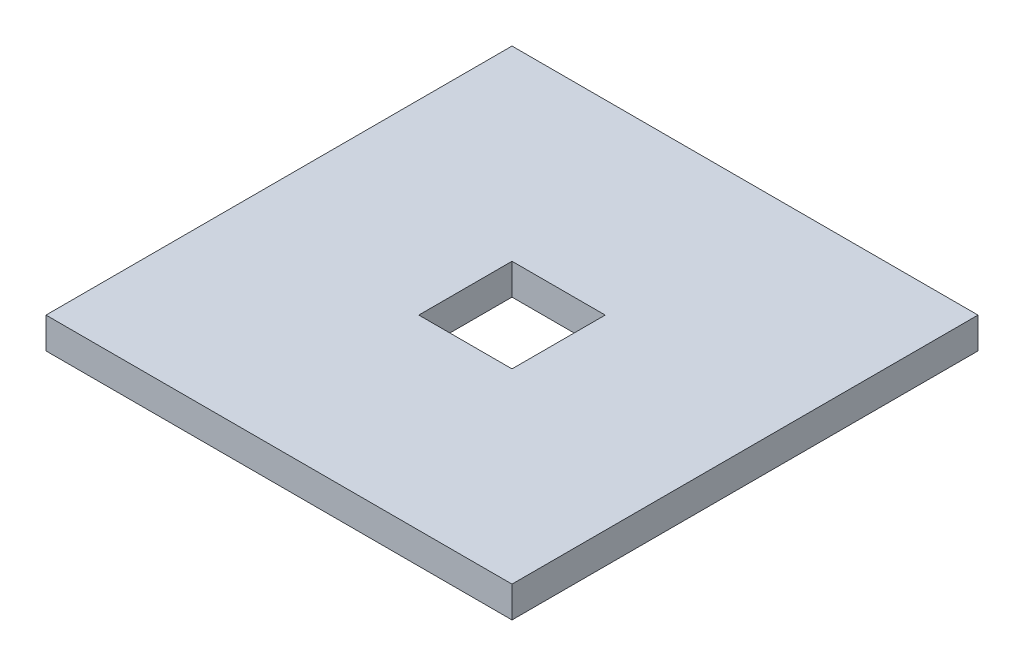
ISO-10303-21;
HEADER;
FILE_DESCRIPTION(('STEP AP214'),'2;1');
FILE_NAME('part.step','',(''),(''),'','','');
FILE_SCHEMA(('AUTOMOTIVE_DESIGN { 1 0 10303 214 1 1 1 1 }'));
ENDSEC;
DATA;
#1=APPLICATION_CONTEXT('core data for automotive mechanical design processes');
#2=APPLICATION_PROTOCOL_DEFINITION('international standard','automotive_design',2000,#1);
#3=PRODUCT_CONTEXT('',#1,'mechanical');
#4=PRODUCT('Part','Part','',(#3));
#5=PRODUCT_RELATED_PRODUCT_CATEGORY('part','',(#4));
#6=PRODUCT_DEFINITION_FORMATION('','',#4);
#7=PRODUCT_DEFINITION_CONTEXT('part definition',#1,'design');
#8=PRODUCT_DEFINITION('design','',#6,#7);
#9=PRODUCT_DEFINITION_SHAPE('','',#8);
#10=(LENGTH_UNIT() NAMED_UNIT(*) SI_UNIT(.MILLI.,.METRE.));
#11=(NAMED_UNIT(*) PLANE_ANGLE_UNIT() SI_UNIT($,.RADIAN.));
#12=(NAMED_UNIT(*) SI_UNIT($,.STERADIAN.) SOLID_ANGLE_UNIT());
#13=UNCERTAINTY_MEASURE_WITH_UNIT(LENGTH_MEASURE(1.E-05),#10,'distance_accuracy_value','');
#14=(GEOMETRIC_REPRESENTATION_CONTEXT(3) GLOBAL_UNCERTAINTY_ASSIGNED_CONTEXT((#13)) GLOBAL_UNIT_ASSIGNED_CONTEXT((#10,
#11,#12)) REPRESENTATION_CONTEXT('',''));
#15=CARTESIAN_POINT('',(0.,0.,0.));
#16=DIRECTION('',(0.,0.,1.));
#17=DIRECTION('',(1.,0.,0.));
#18=AXIS2_PLACEMENT_3D('',#15,#16,#17);
#19=CARTESIAN_POINT('',(0.,100.,-900.));
#20=DIRECTION('',(0.,0.,-1.));
#21=DIRECTION('',(-1.,0.,0.));
#22=AXIS2_PLACEMENT_3D('',#19,#20,#21);
#23=PLANE('',#22);
#24=DIRECTION('',(1.,0.,0.));
#25=VECTOR('',#24,1.);
#26=CARTESIAN_POINT('',(0.,0.,-900.));
#27=LINE('',#26,#25);
#28=CARTESIAN_POINT('',(600.,0.,-900.));
#29=VERTEX_POINT('',#28);
#30=CARTESIAN_POINT('',(900.,0.,-900.));
#31=VERTEX_POINT('',#30);
#32=EDGE_CURVE('E144',#29,#31,#27,.T.);
#33=ORIENTED_EDGE('',*,*,#32,.T.);
#34=DIRECTION('',(0.,-1.,0.));
#35=VECTOR('',#34,1.);
#36=CARTESIAN_POINT('',(900.,100.,-900.));
#37=LINE('',#36,#35);
#38=CARTESIAN_POINT('',(900.,100.,-900.));
#39=VERTEX_POINT('',#38);
#40=EDGE_CURVE('E11',#39,#31,#37,.T.);
#41=ORIENTED_EDGE('',*,*,#40,.F.);
#42=DIRECTION('',(1.,0.,0.));
#43=VECTOR('',#42,1.);
#44=CARTESIAN_POINT('',(0.,100.,-900.));
#45=LINE('',#44,#43);
#46=CARTESIAN_POINT('',(600.,100.,-900.));
#47=VERTEX_POINT('',#46);
#48=EDGE_CURVE('E115',#47,#39,#45,.T.);
#49=ORIENTED_EDGE('',*,*,#48,.F.);
#50=DIRECTION('',(0.,-1.,0.));
#51=VECTOR('',#50,1.);
#52=CARTESIAN_POINT('',(600.,100.,-900.));
#53=LINE('',#52,#51);
#54=EDGE_CURVE('E54',#47,#29,#53,.T.);
#55=ORIENTED_EDGE('',*,*,#54,.T.);
#56=EDGE_LOOP('',(#33,#41,#49,#55));
#57=FACE_BOUND('',#56,.T.);
#58=ADVANCED_FACE('F35',(#57),#23,.F.);
#59=CARTESIAN_POINT('',(900.000000000001,100.,-6.66133814775095E-13));
#60=DIRECTION('',(1.,0.,0.));
#61=DIRECTION('',(0.,0.,-1.));
#62=AXIS2_PLACEMENT_3D('',#59,#60,#61);
#63=PLANE('',#62);
#64=DIRECTION('',(0.,0.,1.));
#65=VECTOR('',#64,1.);
#66=CARTESIAN_POINT('',(900.000000000001,0.,-6.66133814775095E-13));
#67=LINE('',#66,#65);
#68=CARTESIAN_POINT('',(900.,0.,-600.));
#69=VERTEX_POINT('',#68);
#70=EDGE_CURVE('E121',#31,#69,#67,.T.);
#71=ORIENTED_EDGE('',*,*,#70,.T.);
#72=DIRECTION('',(0.,-1.,0.));
#73=VECTOR('',#72,1.);
#74=CARTESIAN_POINT('',(900.,100.,-600.));
#75=LINE('',#74,#73);
#76=CARTESIAN_POINT('',(900.,100.,-600.));
#77=VERTEX_POINT('',#76);
#78=EDGE_CURVE('E45',#77,#69,#75,.T.);
#79=ORIENTED_EDGE('',*,*,#78,.F.);
#80=DIRECTION('',(0.,0.,1.));
#81=VECTOR('',#80,1.);
#82=CARTESIAN_POINT('',(900.000000000001,100.,-6.66133814775095E-13));
#83=LINE('',#82,#81);
#84=EDGE_CURVE('E109',#39,#77,#83,.T.);
#85=ORIENTED_EDGE('',*,*,#84,.F.);
#86=ORIENTED_EDGE('',*,*,#40,.T.);
#87=EDGE_LOOP('',(#71,#79,#85,#86));
#88=FACE_BOUND('',#87,.T.);
#89=ADVANCED_FACE('F120',(#88),#63,.F.);
#90=CARTESIAN_POINT('',(0.,100.,-600.));
#91=DIRECTION('',(0.,0.,-1.));
#92=DIRECTION('',(-1.,0.,0.));
#93=AXIS2_PLACEMENT_3D('',#90,#91,#92);
#94=PLANE('',#93);
#95=DIRECTION('',(1.,0.,0.));
#96=VECTOR('',#95,1.);
#97=CARTESIAN_POINT('',(0.,0.,-600.));
#98=LINE('',#97,#96);
#99=CARTESIAN_POINT('',(600.,0.,-600.));
#100=VERTEX_POINT('',#99);
#101=EDGE_CURVE('E147',#100,#69,#98,.T.);
#102=ORIENTED_EDGE('',*,*,#101,.F.);
#103=DIRECTION('',(0.,-1.,0.));
#104=VECTOR('',#103,1.);
#105=CARTESIAN_POINT('',(600.,100.,-600.));
#106=LINE('',#105,#104);
#107=CARTESIAN_POINT('',(600.,100.,-600.));
#108=VERTEX_POINT('',#107);
#109=EDGE_CURVE('E80',#108,#100,#106,.T.);
#110=ORIENTED_EDGE('',*,*,#109,.F.);
#111=DIRECTION('',(1.,0.,0.));
#112=VECTOR('',#111,1.);
#113=CARTESIAN_POINT('',(0.,100.,-600.));
#114=LINE('',#113,#112);
#115=EDGE_CURVE('E114',#108,#77,#114,.T.);
#116=ORIENTED_EDGE('',*,*,#115,.T.);
#117=ORIENTED_EDGE('',*,*,#78,.T.);
#118=EDGE_LOOP('',(#102,#110,#116,#117));
#119=FACE_BOUND('',#118,.T.);
#120=ADVANCED_FACE('F125',(#119),#94,.T.);
#121=CARTESIAN_POINT('',(0.,100.,0.));
#122=DIRECTION('',(0.,0.,-1.));
#123=DIRECTION('',(-1.,0.,0.));
#124=AXIS2_PLACEMENT_3D('',#121,#122,#123);
#125=PLANE('',#124);
#126=DIRECTION('',(1.,0.,0.));
#127=VECTOR('',#126,1.);
#128=CARTESIAN_POINT('',(0.,0.,0.));
#129=LINE('',#128,#127);
#130=CARTESIAN_POINT('',(0.,0.,0.));
#131=VERTEX_POINT('',#130);
#132=CARTESIAN_POINT('',(1500.,0.,0.));
#133=VERTEX_POINT('',#132);
#134=EDGE_CURVE('E132',#131,#133,#129,.T.);
#135=ORIENTED_EDGE('',*,*,#134,.T.);
#136=DIRECTION('',(0.,-1.,0.));
#137=VECTOR('',#136,1.);
#138=CARTESIAN_POINT('',(1500.,100.,0.));
#139=LINE('',#138,#137);
#140=CARTESIAN_POINT('',(1500.,100.,0.));
#141=VERTEX_POINT('',#140);
#142=EDGE_CURVE('E39',#141,#133,#139,.T.);
#143=ORIENTED_EDGE('',*,*,#142,.F.);
#144=DIRECTION('',(1.,0.,0.));
#145=VECTOR('',#144,1.);
#146=CARTESIAN_POINT('',(0.,100.,0.));
#147=LINE('',#146,#145);
#148=CARTESIAN_POINT('',(0.,100.,0.));
#149=VERTEX_POINT('',#148);
#150=EDGE_CURVE('E152',#149,#141,#147,.T.);
#151=ORIENTED_EDGE('',*,*,#150,.F.);
#152=DIRECTION('',(0.,-1.,0.));
#153=VECTOR('',#152,1.);
#154=CARTESIAN_POINT('',(0.,100.,0.));
#155=LINE('',#154,#153);
#156=EDGE_CURVE('E128',#149,#131,#155,.T.);
#157=ORIENTED_EDGE('',*,*,#156,.T.);
#158=EDGE_LOOP('',(#135,#143,#151,#157));
#159=FACE_BOUND('',#158,.T.);
#160=ADVANCED_FACE('F37',(#159),#125,.F.);
#161=CARTESIAN_POINT('',(1500.,100.,0.));
#162=DIRECTION('',(-1.,0.,0.));
#163=DIRECTION('',(0.,0.,1.));
#164=AXIS2_PLACEMENT_3D('',#161,#162,#163);
#165=PLANE('',#164);
#166=DIRECTION('',(0.,0.,-1.));
#167=VECTOR('',#166,1.);
#168=CARTESIAN_POINT('',(1500.,0.,0.));
#169=LINE('',#168,#167);
#170=CARTESIAN_POINT('',(1500.,0.,-1500.));
#171=VERTEX_POINT('',#170);
#172=EDGE_CURVE('E135',#133,#171,#169,.T.);
#173=ORIENTED_EDGE('',*,*,#172,.T.);
#174=DIRECTION('',(0.,-1.,0.));
#175=VECTOR('',#174,1.);
#176=CARTESIAN_POINT('',(1500.,100.,-1500.));
#177=LINE('',#176,#175);
#178=CARTESIAN_POINT('',(1500.,100.,-1500.));
#179=VERTEX_POINT('',#178);
#180=EDGE_CURVE('E157',#179,#171,#177,.T.);
#181=ORIENTED_EDGE('',*,*,#180,.F.);
#182=DIRECTION('',(0.,0.,-1.));
#183=VECTOR('',#182,1.);
#184=CARTESIAN_POINT('',(1500.,100.,0.));
#185=LINE('',#184,#183);
#186=EDGE_CURVE('E93',#141,#179,#185,.T.);
#187=ORIENTED_EDGE('',*,*,#186,.F.);
#188=ORIENTED_EDGE('',*,*,#142,.T.);
#189=EDGE_LOOP('',(#173,#181,#187,#188));
#190=FACE_BOUND('',#189,.T.);
#191=ADVANCED_FACE('F162',(#190),#165,.F.);
#192=CARTESIAN_POINT('',(0.,100.,-1500.));
#193=DIRECTION('',(0.,0.,-1.));
#194=DIRECTION('',(-1.,0.,0.));
#195=AXIS2_PLACEMENT_3D('',#192,#193,#194);
#196=PLANE('',#195);
#197=DIRECTION('',(1.,0.,0.));
#198=VECTOR('',#197,1.);
#199=CARTESIAN_POINT('',(0.,0.,-1500.));
#200=LINE('',#199,#198);
#201=CARTESIAN_POINT('',(0.,0.,-1500.));
#202=VERTEX_POINT('',#201);
#203=EDGE_CURVE('E138',#202,#171,#200,.T.);
#204=ORIENTED_EDGE('',*,*,#203,.F.);
#205=DIRECTION('',(0.,-1.,0.));
#206=VECTOR('',#205,1.);
#207=CARTESIAN_POINT('',(0.,100.,-1500.));
#208=LINE('',#207,#206);
#209=CARTESIAN_POINT('',(0.,100.,-1500.));
#210=VERTEX_POINT('',#209);
#211=EDGE_CURVE('E156',#210,#202,#208,.T.);
#212=ORIENTED_EDGE('',*,*,#211,.F.);
#213=DIRECTION('',(1.,0.,0.));
#214=VECTOR('',#213,1.);
#215=CARTESIAN_POINT('',(0.,100.,-1500.));
#216=LINE('',#215,#214);
#217=EDGE_CURVE('E203',#210,#179,#216,.T.);
#218=ORIENTED_EDGE('',*,*,#217,.T.);
#219=ORIENTED_EDGE('',*,*,#180,.T.);
#220=EDGE_LOOP('',(#204,#212,#218,#219));
#221=FACE_BOUND('',#220,.T.);
#222=ADVANCED_FACE('F176',(#221),#196,.T.);
#223=CARTESIAN_POINT('',(0.,100.,0.));
#224=DIRECTION('',(-1.,0.,0.));
#225=DIRECTION('',(0.,0.,1.));
#226=AXIS2_PLACEMENT_3D('',#223,#224,#225);
#227=PLANE('',#226);
#228=DIRECTION('',(0.,0.,-1.));
#229=VECTOR('',#228,1.);
#230=CARTESIAN_POINT('',(0.,0.,0.));
#231=LINE('',#230,#229);
#232=EDGE_CURVE('E141',#131,#202,#231,.T.);
#233=ORIENTED_EDGE('',*,*,#232,.F.);
#234=ORIENTED_EDGE('',*,*,#156,.F.);
#235=DIRECTION('',(0.,0.,-1.));
#236=VECTOR('',#235,1.);
#237=CARTESIAN_POINT('',(0.,100.,0.));
#238=LINE('',#237,#236);
#239=EDGE_CURVE('E174',#149,#210,#238,.T.);
#240=ORIENTED_EDGE('',*,*,#239,.T.);
#241=ORIENTED_EDGE('',*,*,#211,.T.);
#242=EDGE_LOOP('',(#233,#234,#240,#241));
#243=FACE_BOUND('',#242,.T.);
#244=ADVANCED_FACE('F171',(#243),#227,.T.);
#245=CARTESIAN_POINT('',(600.,100.,4.44089209850062E-13));
#246=DIRECTION('',(1.,0.,0.));
#247=DIRECTION('',(0.,0.,-1.));
#248=AXIS2_PLACEMENT_3D('',#245,#246,#247);
#249=PLANE('',#248);
#250=DIRECTION('',(0.,0.,1.));
#251=VECTOR('',#250,1.);
#252=CARTESIAN_POINT('',(600.,0.,4.44089209850062E-13));
#253=LINE('',#252,#251);
#254=EDGE_CURVE('E149',#29,#100,#253,.T.);
#255=ORIENTED_EDGE('',*,*,#254,.F.);
#256=ORIENTED_EDGE('',*,*,#54,.F.);
#257=DIRECTION('',(0.,0.,1.));
#258=VECTOR('',#257,1.);
#259=CARTESIAN_POINT('',(600.,100.,4.44089209850062E-13));
#260=LINE('',#259,#258);
#261=EDGE_CURVE('E126',#47,#108,#260,.T.);
#262=ORIENTED_EDGE('',*,*,#261,.T.);
#263=ORIENTED_EDGE('',*,*,#109,.T.);
#264=EDGE_LOOP('',(#255,#256,#262,#263));
#265=FACE_BOUND('',#264,.T.);
#266=ADVANCED_FACE('F183',(#265),#249,.T.);
#267=CARTESIAN_POINT('',(0.,100.,0.));
#268=DIRECTION('',(0.,1.,0.));
#269=DIRECTION('',(0.,0.,1.));
#270=AXIS2_PLACEMENT_3D('',#267,#268,#269);
#271=PLANE('',#270);
#272=ORIENTED_EDGE('',*,*,#150,.T.);
#273=ORIENTED_EDGE('',*,*,#186,.T.);
#274=ORIENTED_EDGE('',*,*,#217,.F.);
#275=ORIENTED_EDGE('',*,*,#239,.F.);
#276=EDGE_LOOP('',(#272,#273,#274,#275));
#277=FACE_BOUND('',#276,.T.);
#278=ORIENTED_EDGE('',*,*,#48,.T.);
#279=ORIENTED_EDGE('',*,*,#84,.T.);
#280=ORIENTED_EDGE('',*,*,#115,.F.);
#281=ORIENTED_EDGE('',*,*,#261,.F.);
#282=EDGE_LOOP('',(#278,#279,#280,#281));
#283=FACE_BOUND('',#282,.T.);
#284=ADVANCED_FACE('F111',(#277,#283),#271,.T.);
#285=CARTESIAN_POINT('',(0.,0.,0.));
#286=DIRECTION('',(0.,1.,0.));
#287=DIRECTION('',(0.,0.,1.));
#288=AXIS2_PLACEMENT_3D('',#285,#286,#287);
#289=PLANE('',#288);
#290=ORIENTED_EDGE('',*,*,#134,.F.);
#291=ORIENTED_EDGE('',*,*,#232,.T.);
#292=ORIENTED_EDGE('',*,*,#203,.T.);
#293=ORIENTED_EDGE('',*,*,#172,.F.);
#294=EDGE_LOOP('',(#290,#291,#292,#293));
#295=FACE_BOUND('',#294,.T.);
#296=ORIENTED_EDGE('',*,*,#32,.F.);
#297=ORIENTED_EDGE('',*,*,#254,.T.);
#298=ORIENTED_EDGE('',*,*,#101,.T.);
#299=ORIENTED_EDGE('',*,*,#70,.F.);
#300=EDGE_LOOP('',(#296,#297,#298,#299));
#301=FACE_BOUND('',#300,.T.);
#302=ADVANCED_FACE('F168',(#295,#301),#289,.F.);
#303=CLOSED_SHELL('',(#58,#89,#120,#160,#191,#222,#244,#266,#284,#302));
#304=MANIFOLD_SOLID_BREP('B2',#303);
#305=ADVANCED_BREP_SHAPE_REPRESENTATION('',(#18,#304),#14);
#306=SHAPE_DEFINITION_REPRESENTATION(#9,#305);
ENDSEC;
END-ISO-10303-21;
